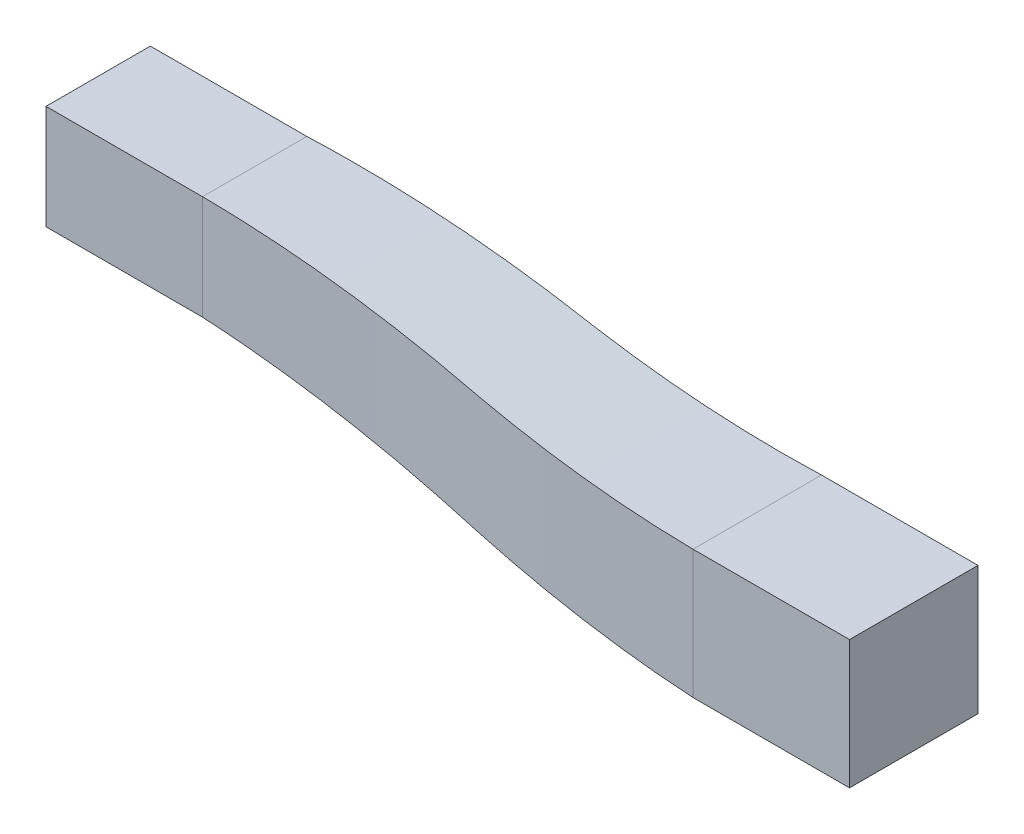
ISO-10303-21;
HEADER;
FILE_DESCRIPTION(('STEP AP214'),'2;1');
FILE_NAME('part.step','',(''),(''),'','','');
FILE_SCHEMA(('AUTOMOTIVE_DESIGN { 1 0 10303 214 1 1 1 1 }'));
ENDSEC;
DATA;
#1=APPLICATION_CONTEXT('core data for automotive mechanical design processes');
#2=APPLICATION_PROTOCOL_DEFINITION('international standard','automotive_design',2000,#1);
#3=PRODUCT_CONTEXT('',#1,'mechanical');
#4=PRODUCT('Part','Part','',(#3));
#5=PRODUCT_RELATED_PRODUCT_CATEGORY('part','',(#4));
#6=PRODUCT_DEFINITION_FORMATION('','',#4);
#7=PRODUCT_DEFINITION_CONTEXT('part definition',#1,'design');
#8=PRODUCT_DEFINITION('design','',#6,#7);
#9=PRODUCT_DEFINITION_SHAPE('','',#8);
#10=(LENGTH_UNIT() NAMED_UNIT(*) SI_UNIT(.MILLI.,.METRE.));
#11=(NAMED_UNIT(*) PLANE_ANGLE_UNIT() SI_UNIT($,.RADIAN.));
#12=(NAMED_UNIT(*) SI_UNIT($,.STERADIAN.) SOLID_ANGLE_UNIT());
#13=UNCERTAINTY_MEASURE_WITH_UNIT(LENGTH_MEASURE(1.E-05),#10,'distance_accuracy_value','');
#14=(GEOMETRIC_REPRESENTATION_CONTEXT(3) GLOBAL_UNCERTAINTY_ASSIGNED_CONTEXT((#13)) GLOBAL_UNIT_ASSIGNED_CONTEXT((#10,
#11,#12)) REPRESENTATION_CONTEXT('',''));
#15=CARTESIAN_POINT('',(0.,0.,0.));
#16=DIRECTION('',(0.,0.,1.));
#17=DIRECTION('',(1.,0.,0.));
#18=AXIS2_PLACEMENT_3D('',#15,#16,#17);
#19=CARTESIAN_POINT('',(1021.37315576226,9.46789488822745,125.73));
#20=CARTESIAN_POINT('',(869.226053043045,7.57979946099006,122.103179117669));
#21=CARTESIAN_POINT('',(717.318679962298,22.2117274041479,118.476358235337));
#22=CARTESIAN_POINT('',(393.85544304639,89.2840384754609,110.602358235337));
#23=CARTESIAN_POINT('',(215.92105118721,106.129276935199,106.355179117669));
#24=CARTESIAN_POINT('',(37.7577690383184,103.335476998145,102.108));
#25=CARTESIAN_POINT('',(1021.37315576226,9.46789488822746,115.2525));
#26=CARTESIAN_POINT('',(869.226053043045,7.57979946099006,111.927914191196));
#27=CARTESIAN_POINT('',(717.318679962298,22.2117274041479,108.603328382393));
#28=CARTESIAN_POINT('',(393.85544304639,89.2840384754609,101.385495049059));
#29=CARTESIAN_POINT('',(215.92105118721,106.129276935199,97.4922475245296));
#30=CARTESIAN_POINT('',(37.7577690383184,103.335476998145,93.599));
#31=CARTESIAN_POINT('',(1021.37315576226,9.46789488822747,94.2975));
#32=CARTESIAN_POINT('',(869.226053043045,7.5797994609901,91.5773843382515));
#33=CARTESIAN_POINT('',(717.318679962298,22.211727404148,88.8572686765031));
#34=CARTESIAN_POINT('',(393.85544304639,89.284038475461,82.9517686765031));
#35=CARTESIAN_POINT('',(215.921051187211,106.129276935199,79.7663843382515));
#36=CARTESIAN_POINT('',(37.7577690383184,103.335476998145,76.581));
#37=CARTESIAN_POINT('',(1021.37315576226,9.46789488822745,62.865));
#38=CARTESIAN_POINT('',(869.226053043045,7.57979946099004,61.0515895588344));
#39=CARTESIAN_POINT('',(717.318679962298,22.2117274041479,59.2381791176687));
#40=CARTESIAN_POINT('',(393.85544304639,89.2840384754609,55.3011791176687));
#41=CARTESIAN_POINT('',(215.92105118721,106.129276935199,53.1775895588343));
#42=CARTESIAN_POINT('',(37.7577690383184,103.335476998145,51.054));
#43=CARTESIAN_POINT('',(1021.37315576226,9.46789488822748,31.4325));
#44=CARTESIAN_POINT('',(869.226053043045,7.5797994609901,30.5257947794172));
#45=CARTESIAN_POINT('',(717.318679962298,22.211727404148,29.6190895588343));
#46=CARTESIAN_POINT('',(393.85544304639,89.284038475461,27.6505895588344));
#47=CARTESIAN_POINT('',(215.92105118721,106.129276935199,26.5887947794172));
#48=CARTESIAN_POINT('',(37.7577690383184,103.335476998145,25.527));
#49=CARTESIAN_POINT('',(1021.37315576226,9.46789488822747,10.4775));
#50=CARTESIAN_POINT('',(869.226053043045,7.57979946099008,10.1752649264724));
#51=CARTESIAN_POINT('',(717.318679962298,22.2117274041479,9.87302985294478));
#52=CARTESIAN_POINT('',(393.85544304639,89.2840384754609,9.21686318627812));
#53=CARTESIAN_POINT('',(215.92105118721,106.129276935199,8.86293159313906));
#54=CARTESIAN_POINT('',(37.7577690383184,103.335476998145,8.509));
#55=CARTESIAN_POINT('',(1021.37315576226,9.46789488822748,-10.4775));
#56=CARTESIAN_POINT('',(869.226053043045,7.57979946099008,-10.1752649264724));
#57=CARTESIAN_POINT('',(717.318679962298,22.2117274041479,-9.87302985294478));
#58=CARTESIAN_POINT('',(393.85544304639,89.2840384754609,-9.21686318627812));
#59=CARTESIAN_POINT('',(215.92105118721,106.129276935199,-8.86293159313906));
#60=CARTESIAN_POINT('',(37.7577690383184,103.335476998145,-8.509));
#61=CARTESIAN_POINT('',(1021.37315576226,9.4678948882275,-31.4325));
#62=CARTESIAN_POINT('',(869.226053043045,7.57979946099013,-30.5257947794172));
#63=CARTESIAN_POINT('',(717.318679962298,22.211727404148,-29.6190895588344));
#64=CARTESIAN_POINT('',(393.85544304639,89.2840384754611,-27.6505895588344));
#65=CARTESIAN_POINT('',(215.921051187211,106.1292769352,-26.5887947794172));
#66=CARTESIAN_POINT('',(37.7577690383184,103.335476998145,-25.5270000000001));
#67=CARTESIAN_POINT('',(1021.37315576226,9.46789488822747,-62.865));
#68=CARTESIAN_POINT('',(869.226053043045,7.57979946099003,-61.0515895588343));
#69=CARTESIAN_POINT('',(717.318679962298,22.2117274041478,-59.2381791176687));
#70=CARTESIAN_POINT('',(393.85544304639,89.2840384754607,-55.3011791176686));
#71=CARTESIAN_POINT('',(215.92105118721,106.129276935199,-53.1775895588343));
#72=CARTESIAN_POINT('',(37.7577690383184,103.335476998145,-51.0539999999999));
#73=CARTESIAN_POINT('',(1021.37315576226,9.46789488822751,-94.2975000000001));
#74=CARTESIAN_POINT('',(869.226053043045,7.57979946099013,-91.5773843382516));
#75=CARTESIAN_POINT('',(717.318679962298,22.211727404148,-88.8572686765031));
#76=CARTESIAN_POINT('',(393.85544304639,89.2840384754611,-82.9517686765031));
#77=CARTESIAN_POINT('',(215.921051187211,106.129276935199,-79.7663843382516));
#78=CARTESIAN_POINT('',(37.7577690383184,103.335476998145,-76.5810000000001));
#79=CARTESIAN_POINT('',(1021.37315576226,9.4678948882275,-115.2525));
#80=CARTESIAN_POINT('',(869.226053043045,7.57979946099008,-111.927914191196));
#81=CARTESIAN_POINT('',(717.318679962298,22.2117274041479,-108.603328382393));
#82=CARTESIAN_POINT('',(393.85544304639,89.2840384754609,-101.385495049059));
#83=CARTESIAN_POINT('',(215.92105118721,106.129276935199,-97.4922475245296));
#84=CARTESIAN_POINT('',(37.7577690383184,103.335476998145,-93.599));
#85=CARTESIAN_POINT('',(1021.37315576226,9.46789488822752,-125.73));
#86=CARTESIAN_POINT('',(869.226053043045,7.57979946099011,-122.103179117669));
#87=CARTESIAN_POINT('',(717.318679962298,22.211727404148,-118.476358235337));
#88=CARTESIAN_POINT('',(393.85544304639,89.2840384754609,-110.602358235337));
#89=CARTESIAN_POINT('',(215.92105118721,106.129276935199,-106.355179117669));
#90=CARTESIAN_POINT('',(37.7577690383184,103.335476998145,-102.108));
#91=B_SPLINE_SURFACE_WITH_KNOTS('',3,3,((#19,#20,#21,#22,#23,#24),(#25,#26,#27,#28,#29,#30),
(#31,#32,#33,#34,#35,#36),(#37,#38,#39,#40,#41,#42),(#43,#44,#45,#46,#47,#48),(#49,#50,#51,#52,
#53,#54),(#55,#56,#57,#58,#59,#60),(#61,#62,#63,#64,#65,#66),(#67,#68,#69,#70,#71,#72),(#73,#74,
#75,#76,#77,#78),(#79,#80,#81,#82,#83,#84),(#85,#86,#87,#88,#89,#90)),.UNSPECIFIED.,.F.,.F.,.F.,
(4,1,1,1,2,1,1,1,4),(4,2,4),(0.75,0.78125,0.8125,0.84375,0.875,0.90625,0.9375,0.96875,1.),(0.,
0.460607173270421,1.),.UNSPECIFIED.);
#92=DIRECTION('',(0.,0.,1.));
#93=VECTOR('',#92,1.);
#94=CARTESIAN_POINT('',(1021.37315576226,9.46789488822745,125.73));
#95=LINE('',#94,#93);
#96=CARTESIAN_POINT('',(1021.37315576226,9.46789488822752,-125.73));
#97=VERTEX_POINT('',#96);
#98=CARTESIAN_POINT('',(1021.37315576226,9.46789488822745,125.73));
#99=VERTEX_POINT('',#98);
#100=EDGE_CURVE('E173',#97,#99,#95,.T.);
#101=CARTESIAN_POINT('',(1021.37315576226,9.46789488822752,-125.73));
#102=CARTESIAN_POINT('',(869.226053043045,7.57979946099011,-122.103179117669));
#103=CARTESIAN_POINT('',(717.318679962298,22.211727404148,-118.476358235337));
#104=CARTESIAN_POINT('',(393.85544304639,89.2840384754609,-110.602358235337));
#105=CARTESIAN_POINT('',(215.92105118721,106.129276935199,-106.355179117669));
#106=CARTESIAN_POINT('',(37.7577690383184,103.335476998145,-102.108));
#107=B_SPLINE_CURVE_WITH_KNOTS('',3,(#101,#102,#103,#104,#105,#106),.UNSPECIFIED.,.F.,.F.,(4,2,
4),(0.,0.460607173270421,1.),.UNSPECIFIED.);
#108=CARTESIAN_POINT('',(37.7577690383184,103.335476998145,-102.108));
#109=VERTEX_POINT('',#108);
#110=EDGE_CURVE('E183',#97,#109,#107,.T.);
#111=DIRECTION('',(0.,0.,-1.));
#112=VECTOR('',#111,1.);
#113=CARTESIAN_POINT('',(37.7577690383184,103.335476998145,-102.108));
#114=LINE('',#113,#112);
#115=CARTESIAN_POINT('',(37.7577690383184,103.335476998145,102.108));
#116=VERTEX_POINT('',#115);
#117=EDGE_CURVE('E181',#116,#109,#114,.T.);
#118=CARTESIAN_POINT('',(1021.37315576226,9.46789488822745,125.73));
#119=CARTESIAN_POINT('',(869.226053043045,7.57979946099006,122.103179117669));
#120=CARTESIAN_POINT('',(717.318679962298,22.2117274041479,118.476358235337));
#121=CARTESIAN_POINT('',(393.85544304639,89.2840384754609,110.602358235337));
#122=CARTESIAN_POINT('',(215.92105118721,106.129276935199,106.355179117669));
#123=CARTESIAN_POINT('',(37.7577690383184,103.335476998145,102.108));
#124=B_SPLINE_CURVE_WITH_KNOTS('',3,(#118,#119,#120,#121,#122,#123),.UNSPECIFIED.,.F.,.F.,(4,2,
4),(0.,0.460607173270421,1.),.UNSPECIFIED.);
#125=EDGE_CURVE('E162',#99,#116,#124,.T.);
#126=ORIENTED_EDGE('',*,*,#100,.F.);
#127=ORIENTED_EDGE('',*,*,#110,.T.);
#128=ORIENTED_EDGE('',*,*,#117,.F.);
#129=ORIENTED_EDGE('',*,*,#125,.F.);
#130=EDGE_LOOP('',(#126,#127,#128,#129));
#131=FACE_BOUND('',#130,.T.);
#132=ADVANCED_FACE('F115',(#131),#91,.T.);
#133=CARTESIAN_POINT('',(1021.37315576226,-241.992105111773,125.73));
#134=CARTESIAN_POINT('',(869.226053043045,-236.626558774347,122.103179117669));
#135=CARTESIAN_POINT('',(717.318679962298,-214.740989066527,118.476358235337));
#136=CARTESIAN_POINT('',(393.85544304639,-131.920677995214,110.602358235337));
#137=CARTESIAN_POINT('',(215.92105118721,-106.581081300138,106.355179117669));
#138=CARTESIAN_POINT('',(37.7577690383184,-100.880523001855,102.108));
#139=CARTESIAN_POINT('',(1021.37315576226,-221.037105111773,125.73));
#140=CARTESIAN_POINT('',(869.226053043045,-216.276028921403,122.103179117669));
#141=CARTESIAN_POINT('',(717.318679962298,-194.994929360637,118.476358235337));
#142=CARTESIAN_POINT('',(393.85544304639,-113.486951622658,110.602358235337));
#143=CARTESIAN_POINT('',(215.92105118721,-88.85521811386,106.355179117669));
#144=CARTESIAN_POINT('',(37.7577690383184,-83.8625230018548,102.108));
#145=CARTESIAN_POINT('',(1021.37315576226,-179.127105111773,125.73));
#146=CARTESIAN_POINT('',(869.226053043045,-175.574969215513,122.103179117669));
#147=CARTESIAN_POINT('',(717.318679962298,-155.502809948858,118.476358235338));
#148=CARTESIAN_POINT('',(393.85544304639,-76.6194988775453,110.602358235338));
#149=CARTESIAN_POINT('',(215.921051187211,-53.4034917413038,106.355179117669));
#150=CARTESIAN_POINT('',(37.7577690383184,-49.8265230018548,102.108));
#151=CARTESIAN_POINT('',(1021.37315576226,-116.262105111772,125.73));
#152=CARTESIAN_POINT('',(869.226053043045,-114.523379656678,122.103179117668));
#153=CARTESIAN_POINT('',(717.318679962298,-96.2646308311893,118.476358235337));
#154=CARTESIAN_POINT('',(393.85544304639,-21.3183197598764,110.602358235337));
#155=CARTESIAN_POINT('',(215.92105118721,-0.225902182469349,106.355179117669));
#156=CARTESIAN_POINT('',(37.7577690383184,1.22747699814513,102.108));
#157=CARTESIAN_POINT('',(1021.37315576226,-53.3971051117727,125.73));
#158=CARTESIAN_POINT('',(869.226053043045,-53.4717900978445,122.103179117669));
#159=CARTESIAN_POINT('',(717.318679962298,-37.0264517135209,118.476358235338));
#160=CARTESIAN_POINT('',(393.85544304639,33.9828593577921,110.602358235338));
#161=CARTESIAN_POINT('',(215.92105118721,52.951687376365,106.355179117669));
#162=CARTESIAN_POINT('',(37.7577690383184,52.2814769981452,102.108));
#163=CARTESIAN_POINT('',(1021.37315576226,-11.4871051117725,125.73));
#164=CARTESIAN_POINT('',(869.226053043045,-12.7707303919547,122.103179117669));
#165=CARTESIAN_POINT('',(717.318679962298,2.46566769825833,118.476358235337));
#166=CARTESIAN_POINT('',(393.85544304639,70.8503121029046,110.602358235337));
#167=CARTESIAN_POINT('',(215.92105118721,88.4034137489212,106.355179117669));
#168=CARTESIAN_POINT('',(37.7577690383184,86.3174769981451,102.108));
#169=CARTESIAN_POINT('',(1021.37315576226,9.46789488822745,125.73));
#170=CARTESIAN_POINT('',(869.226053043045,7.57979946099006,122.103179117669));
#171=CARTESIAN_POINT('',(717.318679962298,22.2117274041479,118.476358235337));
#172=CARTESIAN_POINT('',(393.85544304639,89.2840384754609,110.602358235337));
#173=CARTESIAN_POINT('',(215.92105118721,106.129276935199,106.355179117669));
#174=CARTESIAN_POINT('',(37.7577690383184,103.335476998145,102.108));
#175=B_SPLINE_SURFACE_WITH_KNOTS('',3,3,((#133,#134,#135,#136,#137,#138),(#139,#140,#141,#142,
#143,#144),(#145,#146,#147,#148,#149,#150),(#151,#152,#153,#154,#155,#156),(#157,#158,#159,#160,
#161,#162),(#163,#164,#165,#166,#167,#168),(#169,#170,#171,#172,#173,#174)),.UNSPECIFIED.,.F.,
.F.,.F.,(4,1,1,1,4),(4,2,4),(0.5,0.5625,0.625,0.6875,0.75),(0.,0.460607173270421,1.),.UNSPECIFIED.);
#176=DIRECTION('',(0.,-1.,0.));
#177=VECTOR('',#176,1.);
#178=CARTESIAN_POINT('',(1021.37315576226,9.46789488822745,125.73));
#179=LINE('',#178,#177);
#180=CARTESIAN_POINT('',(1021.37315576226,-241.992105111773,125.73));
#181=VERTEX_POINT('',#180);
#182=EDGE_CURVE('E157',#99,#181,#179,.T.);
#183=DIRECTION('',(0.,1.,0.));
#184=VECTOR('',#183,1.);
#185=CARTESIAN_POINT('',(37.7577690383184,-100.880523001855,102.108));
#186=LINE('',#185,#184);
#187=CARTESIAN_POINT('',(37.7577690383184,-100.880523001855,102.108));
#188=VERTEX_POINT('',#187);
#189=EDGE_CURVE('E297',#188,#116,#186,.T.);
#190=CARTESIAN_POINT('',(1021.37315576226,-241.992105111773,125.73));
#191=CARTESIAN_POINT('',(869.226053043045,-236.626558774347,122.103179117669));
#192=CARTESIAN_POINT('',(717.318679962298,-214.740989066527,118.476358235337));
#193=CARTESIAN_POINT('',(393.85544304639,-131.920677995214,110.602358235337));
#194=CARTESIAN_POINT('',(215.92105118721,-106.581081300138,106.355179117669));
#195=CARTESIAN_POINT('',(37.7577690383184,-100.880523001855,102.108));
#196=B_SPLINE_CURVE_WITH_KNOTS('',3,(#190,#191,#192,#193,#194,#195),.UNSPECIFIED.,.F.,.F.,(4,2,
4),(0.,0.460607173270421,1.),.UNSPECIFIED.);
#197=EDGE_CURVE('E165',#181,#188,#196,.T.);
#198=ORIENTED_EDGE('',*,*,#182,.F.);
#199=ORIENTED_EDGE('',*,*,#125,.T.);
#200=ORIENTED_EDGE('',*,*,#189,.F.);
#201=ORIENTED_EDGE('',*,*,#197,.F.);
#202=EDGE_LOOP('',(#198,#199,#200,#201));
#203=FACE_BOUND('',#202,.T.);
#204=ADVANCED_FACE('F160',(#203),#175,.T.);
#205=CARTESIAN_POINT('',(1021.37315576226,-241.992105111773,-125.73));
#206=CARTESIAN_POINT('',(869.226053043045,-236.626558774347,-122.103179117669));
#207=CARTESIAN_POINT('',(717.318679962298,-214.740989066527,-118.476358235337));
#208=CARTESIAN_POINT('',(393.85544304639,-131.920677995214,-110.602358235337));
#209=CARTESIAN_POINT('',(215.92105118721,-106.581081300138,-106.355179117669));
#210=CARTESIAN_POINT('',(37.7577690383184,-100.880523001855,-102.108));
#211=CARTESIAN_POINT('',(1021.37315576226,-241.992105111773,-104.775));
#212=CARTESIAN_POINT('',(869.226053043045,-236.626558774347,-101.752649264724));
#213=CARTESIAN_POINT('',(717.318679962298,-214.740989066527,-98.7302985294479));
#214=CARTESIAN_POINT('',(393.85544304639,-131.920677995214,-92.1686318627812));
#215=CARTESIAN_POINT('',(215.92105118721,-106.581081300138,-88.6293159313906));
#216=CARTESIAN_POINT('',(37.7577690383184,-100.880523001855,-85.09));
#217=CARTESIAN_POINT('',(1021.37315576226,-241.992105111773,-62.8650000000001));
#218=CARTESIAN_POINT('',(869.226053043045,-236.626558774348,-61.0515895588344));
#219=CARTESIAN_POINT('',(717.318679962298,-214.740989066527,-59.2381791176688));
#220=CARTESIAN_POINT('',(393.85544304639,-131.920677995214,-55.3011791176688));
#221=CARTESIAN_POINT('',(215.921051187211,-106.581081300138,-53.1775895588344));
#222=CARTESIAN_POINT('',(37.7577690383184,-100.880523001855,-51.054));
#223=CARTESIAN_POINT('',(1021.37315576226,-241.992105111772,0.));
#224=CARTESIAN_POINT('',(869.226053043045,-236.626558774347,0.));
#225=CARTESIAN_POINT('',(717.318679962298,-214.740989066527,0.));
#226=CARTESIAN_POINT('',(393.85544304639,-131.920677995214,0.));
#227=CARTESIAN_POINT('',(215.92105118721,-106.581081300138,0.));
#228=CARTESIAN_POINT('',(37.7577690383184,-100.880523001855,0.));
#229=CARTESIAN_POINT('',(1021.37315576226,-241.992105111773,62.865));
#230=CARTESIAN_POINT('',(869.226053043045,-236.626558774348,61.0515895588343));
#231=CARTESIAN_POINT('',(717.318679962298,-214.740989066527,59.2381791176687));
#232=CARTESIAN_POINT('',(393.85544304639,-131.920677995214,55.3011791176687));
#233=CARTESIAN_POINT('',(215.92105118721,-106.581081300138,53.1775895588343));
#234=CARTESIAN_POINT('',(37.7577690383184,-100.880523001855,51.054));
#235=CARTESIAN_POINT('',(1021.37315576226,-241.992105111773,104.775));
#236=CARTESIAN_POINT('',(869.226053043045,-236.626558774347,101.752649264724));
#237=CARTESIAN_POINT('',(717.318679962298,-214.740989066527,98.7302985294478));
#238=CARTESIAN_POINT('',(393.85544304639,-131.920677995214,92.1686318627812));
#239=CARTESIAN_POINT('',(215.92105118721,-106.581081300138,88.6293159313906));
#240=CARTESIAN_POINT('',(37.7577690383184,-100.880523001855,85.09));
#241=CARTESIAN_POINT('',(1021.37315576226,-241.992105111773,125.73));
#242=CARTESIAN_POINT('',(869.226053043045,-236.626558774347,122.103179117669));
#243=CARTESIAN_POINT('',(717.318679962298,-214.740989066527,118.476358235337));
#244=CARTESIAN_POINT('',(393.85544304639,-131.920677995214,110.602358235337));
#245=CARTESIAN_POINT('',(215.92105118721,-106.581081300138,106.355179117669));
#246=CARTESIAN_POINT('',(37.7577690383184,-100.880523001855,102.108));
#247=B_SPLINE_SURFACE_WITH_KNOTS('',3,3,((#205,#206,#207,#208,#209,#210),(#211,#212,#213,#214,
#215,#216),(#217,#218,#219,#220,#221,#222),(#223,#224,#225,#226,#227,#228),(#229,#230,#231,#232,
#233,#234),(#235,#236,#237,#238,#239,#240),(#241,#242,#243,#244,#245,#246)),.UNSPECIFIED.,.F.,
.F.,.F.,(4,1,1,1,4),(4,2,4),(0.25,0.3125,0.375,0.4375,0.5),(0.,0.460607173270421,1.),.UNSPECIFIED.);
#248=DIRECTION('',(0.,0.,-1.));
#249=VECTOR('',#248,1.);
#250=CARTESIAN_POINT('',(1021.37315576226,-241.992105111773,125.73));
#251=LINE('',#250,#249);
#252=CARTESIAN_POINT('',(1021.37315576226,-241.992105111773,-125.73));
#253=VERTEX_POINT('',#252);
#254=EDGE_CURVE('E172',#181,#253,#251,.T.);
#255=DIRECTION('',(0.,0.,1.));
#256=VECTOR('',#255,1.);
#257=CARTESIAN_POINT('',(37.7577690383184,-100.880523001855,-102.108));
#258=LINE('',#257,#256);
#259=CARTESIAN_POINT('',(37.7577690383184,-100.880523001855,-102.108));
#260=VERTEX_POINT('',#259);
#261=EDGE_CURVE('E13',#260,#188,#258,.T.);
#262=CARTESIAN_POINT('',(1021.37315576226,-241.992105111773,-125.73));
#263=CARTESIAN_POINT('',(869.226053043045,-236.626558774347,-122.103179117669));
#264=CARTESIAN_POINT('',(717.318679962298,-214.740989066527,-118.476358235337));
#265=CARTESIAN_POINT('',(393.85544304639,-131.920677995214,-110.602358235337));
#266=CARTESIAN_POINT('',(215.92105118721,-106.581081300138,-106.355179117669));
#267=CARTESIAN_POINT('',(37.7577690383184,-100.880523001855,-102.108));
#268=B_SPLINE_CURVE_WITH_KNOTS('',3,(#262,#263,#264,#265,#266,#267),.UNSPECIFIED.,.F.,.F.,(4,2,
4),(0.,0.460607173270421,1.),.UNSPECIFIED.);
#269=EDGE_CURVE('E135',#253,#260,#268,.T.);
#270=ORIENTED_EDGE('',*,*,#254,.F.);
#271=ORIENTED_EDGE('',*,*,#197,.T.);
#272=ORIENTED_EDGE('',*,*,#261,.F.);
#273=ORIENTED_EDGE('',*,*,#269,.F.);
#274=EDGE_LOOP('',(#270,#271,#272,#273));
#275=FACE_BOUND('',#274,.T.);
#276=ADVANCED_FACE('F337',(#275),#247,.T.);
#277=CARTESIAN_POINT('',(1021.37315576226,9.46789488822752,-125.73));
#278=CARTESIAN_POINT('',(869.226053043045,7.57979946099011,-122.103179117669));
#279=CARTESIAN_POINT('',(717.318679962298,22.211727404148,-118.476358235337));
#280=CARTESIAN_POINT('',(393.85544304639,89.2840384754609,-110.602358235337));
#281=CARTESIAN_POINT('',(215.92105118721,106.129276935199,-106.355179117669));
#282=CARTESIAN_POINT('',(37.7577690383184,103.335476998145,-102.108));
#283=CARTESIAN_POINT('',(1021.37315576226,-11.4871051117725,-125.73));
#284=CARTESIAN_POINT('',(869.226053043045,-12.7707303919547,-122.103179117669));
#285=CARTESIAN_POINT('',(717.318679962298,2.46566769825838,-118.476358235337));
#286=CARTESIAN_POINT('',(393.85544304639,70.8503121029047,-110.602358235337));
#287=CARTESIAN_POINT('',(215.92105118721,88.4034137489212,-106.355179117669));
#288=CARTESIAN_POINT('',(37.7577690383184,86.3174769981452,-102.108));
#289=CARTESIAN_POINT('',(1021.37315576226,-53.3971051117727,-125.73));
#290=CARTESIAN_POINT('',(869.226053043045,-53.4717900978444,-122.103179117669));
#291=CARTESIAN_POINT('',(717.318679962298,-37.0264517135209,-118.476358235338));
#292=CARTESIAN_POINT('',(393.85544304639,33.9828593577921,-110.602358235338));
#293=CARTESIAN_POINT('',(215.921051187211,52.9516873763649,-106.355179117669));
#294=CARTESIAN_POINT('',(37.7577690383184,52.2814769981451,-102.108));
#295=CARTESIAN_POINT('',(1021.37315576226,-116.262105111772,-125.73));
#296=CARTESIAN_POINT('',(869.226053043045,-114.523379656678,-122.103179117669));
#297=CARTESIAN_POINT('',(717.318679962298,-96.2646308311893,-118.476358235337));
#298=CARTESIAN_POINT('',(393.85544304639,-21.3183197598764,-110.602358235337));
#299=CARTESIAN_POINT('',(215.92105118721,-0.225902182469283,-106.355179117669));
#300=CARTESIAN_POINT('',(37.7577690383184,1.22747699814521,-102.108));
#301=CARTESIAN_POINT('',(1021.37315576226,-179.127105111773,-125.73));
#302=CARTESIAN_POINT('',(869.226053043045,-175.574969215513,-122.103179117669));
#303=CARTESIAN_POINT('',(717.318679962298,-155.502809948858,-118.476358235338));
#304=CARTESIAN_POINT('',(393.85544304639,-76.6194988775453,-110.602358235338));
#305=CARTESIAN_POINT('',(215.92105118721,-53.4034917413038,-106.355179117669));
#306=CARTESIAN_POINT('',(37.7577690383184,-49.8265230018549,-102.108));
#307=CARTESIAN_POINT('',(1021.37315576226,-221.037105111772,-125.73));
#308=CARTESIAN_POINT('',(869.226053043045,-216.276028921403,-122.103179117669));
#309=CARTESIAN_POINT('',(717.318679962298,-194.994929360637,-118.476358235337));
#310=CARTESIAN_POINT('',(393.85544304639,-113.486951622658,-110.602358235337));
#311=CARTESIAN_POINT('',(215.92105118721,-88.85521811386,-106.355179117669));
#312=CARTESIAN_POINT('',(37.7577690383184,-83.8625230018548,-102.108));
#313=CARTESIAN_POINT('',(1021.37315576226,-241.992105111773,-125.73));
#314=CARTESIAN_POINT('',(869.226053043045,-236.626558774347,-122.103179117669));
#315=CARTESIAN_POINT('',(717.318679962298,-214.740989066527,-118.476358235337));
#316=CARTESIAN_POINT('',(393.85544304639,-131.920677995214,-110.602358235337));
#317=CARTESIAN_POINT('',(215.92105118721,-106.581081300138,-106.355179117669));
#318=CARTESIAN_POINT('',(37.7577690383184,-100.880523001855,-102.108));
#319=B_SPLINE_SURFACE_WITH_KNOTS('',3,3,((#277,#278,#279,#280,#281,#282),(#283,#284,#285,#286,
#287,#288),(#289,#290,#291,#292,#293,#294),(#295,#296,#297,#298,#299,#300),(#301,#302,#303,#304,
#305,#306),(#307,#308,#309,#310,#311,#312),(#313,#314,#315,#316,#317,#318)),.UNSPECIFIED.,.F.,
.F.,.F.,(4,1,1,1,4),(4,2,4),(0.,0.0625,0.125,0.1875,0.25),(0.,0.460607173270421,1.),.UNSPECIFIED.);
#320=DIRECTION('',(0.,1.,0.));
#321=VECTOR('',#320,1.);
#322=CARTESIAN_POINT('',(1021.37315576226,-241.992105111773,-125.73));
#323=LINE('',#322,#321);
#324=EDGE_CURVE('E121',#253,#97,#323,.T.);
#325=DIRECTION('',(0.,-1.,0.));
#326=VECTOR('',#325,1.);
#327=CARTESIAN_POINT('',(37.7577690383184,103.335476998145,-102.108));
#328=LINE('',#327,#326);
#329=EDGE_CURVE('E127',#109,#260,#328,.T.);
#330=ORIENTED_EDGE('',*,*,#324,.F.);
#331=ORIENTED_EDGE('',*,*,#269,.T.);
#332=ORIENTED_EDGE('',*,*,#329,.F.);
#333=ORIENTED_EDGE('',*,*,#110,.F.);
#334=EDGE_LOOP('',(#330,#331,#332,#333));
#335=FACE_BOUND('',#334,.T.);
#336=ADVANCED_FACE('F341',(#335),#319,.T.);
#337=CARTESIAN_POINT('',(-268.566230961682,-100.880523001855,102.108));
#338=DIRECTION('',(0.,0.,-1.));
#339=DIRECTION('',(-1.,0.,0.));
#340=AXIS2_PLACEMENT_3D('',#337,#338,#339);
#341=PLANE('',#340);
#342=ORIENTED_EDGE('',*,*,#189,.T.);
#343=DIRECTION('',(1.,0.,0.));
#344=VECTOR('',#343,1.);
#345=CARTESIAN_POINT('',(-268.566230961682,103.335476998145,102.108));
#346=LINE('',#345,#344);
#347=CARTESIAN_POINT('',(-268.566230961682,103.335476998145,102.108));
#348=VERTEX_POINT('',#347);
#349=EDGE_CURVE('E491',#348,#116,#346,.T.);
#350=ORIENTED_EDGE('',*,*,#349,.F.);
#351=DIRECTION('',(0.,1.,0.));
#352=VECTOR('',#351,1.);
#353=CARTESIAN_POINT('',(-268.566230961682,-100.880523001855,102.108));
#354=LINE('',#353,#352);
#355=CARTESIAN_POINT('',(-268.566230961682,-100.880523001855,102.108));
#356=VERTEX_POINT('',#355);
#357=EDGE_CURVE('E205',#356,#348,#354,.T.);
#358=ORIENTED_EDGE('',*,*,#357,.F.);
#359=DIRECTION('',(1.,0.,0.));
#360=VECTOR('',#359,1.);
#361=CARTESIAN_POINT('',(-268.566230961682,-100.880523001855,102.108));
#362=LINE('',#361,#360);
#363=EDGE_CURVE('E273',#356,#188,#362,.T.);
#364=ORIENTED_EDGE('',*,*,#363,.T.);
#365=EDGE_LOOP('',(#342,#350,#358,#364));
#366=FACE_BOUND('',#365,.T.);
#367=ADVANCED_FACE('F388',(#366),#341,.F.);
#368=CARTESIAN_POINT('',(-268.566230961682,103.335476998145,-102.108));
#369=DIRECTION('',(0.,-1.,0.));
#370=DIRECTION('',(0.,0.,-1.));
#371=AXIS2_PLACEMENT_3D('',#368,#369,#370);
#372=PLANE('',#371);
#373=ORIENTED_EDGE('',*,*,#117,.T.);
#374=DIRECTION('',(1.,0.,0.));
#375=VECTOR('',#374,1.);
#376=CARTESIAN_POINT('',(-268.566230961682,103.335476998145,-102.108));
#377=LINE('',#376,#375);
#378=CARTESIAN_POINT('',(-268.566230961682,103.335476998145,-102.108));
#379=VERTEX_POINT('',#378);
#380=EDGE_CURVE('E272',#379,#109,#377,.T.);
#381=ORIENTED_EDGE('',*,*,#380,.F.);
#382=DIRECTION('',(0.,0.,-1.));
#383=VECTOR('',#382,1.);
#384=CARTESIAN_POINT('',(-268.566230961682,103.335476998145,-102.108));
#385=LINE('',#384,#383);
#386=EDGE_CURVE('E431',#348,#379,#385,.T.);
#387=ORIENTED_EDGE('',*,*,#386,.F.);
#388=ORIENTED_EDGE('',*,*,#349,.T.);
#389=EDGE_LOOP('',(#373,#381,#387,#388));
#390=FACE_BOUND('',#389,.T.);
#391=ADVANCED_FACE('F489',(#390),#372,.F.);
#392=CARTESIAN_POINT('',(-268.566230961682,103.335476998145,-102.108));
#393=DIRECTION('',(0.,0.,1.));
#394=DIRECTION('',(0.,-1.,0.));
#395=AXIS2_PLACEMENT_3D('',#392,#393,#394);
#396=PLANE('',#395);
#397=ORIENTED_EDGE('',*,*,#329,.T.);
#398=DIRECTION('',(1.,0.,0.));
#399=VECTOR('',#398,1.);
#400=CARTESIAN_POINT('',(-268.566230961682,-100.880523001855,-102.108));
#401=LINE('',#400,#399);
#402=CARTESIAN_POINT('',(-268.566230961682,-100.880523001855,-102.108));
#403=VERTEX_POINT('',#402);
#404=EDGE_CURVE('E269',#403,#260,#401,.T.);
#405=ORIENTED_EDGE('',*,*,#404,.F.);
#406=DIRECTION('',(0.,-1.,0.));
#407=VECTOR('',#406,1.);
#408=CARTESIAN_POINT('',(-268.566230961682,103.335476998145,-102.108));
#409=LINE('',#408,#407);
#410=EDGE_CURVE('E427',#379,#403,#409,.T.);
#411=ORIENTED_EDGE('',*,*,#410,.F.);
#412=ORIENTED_EDGE('',*,*,#380,.T.);
#413=EDGE_LOOP('',(#397,#405,#411,#412));
#414=FACE_BOUND('',#413,.T.);
#415=ADVANCED_FACE('F254',(#414),#396,.F.);
#416=CARTESIAN_POINT('',(-268.566230961682,-100.880523001855,-102.108));
#417=DIRECTION('',(0.,1.,0.));
#418=DIRECTION('',(0.,0.,1.));
#419=AXIS2_PLACEMENT_3D('',#416,#417,#418);
#420=PLANE('',#419);
#421=ORIENTED_EDGE('',*,*,#261,.T.);
#422=ORIENTED_EDGE('',*,*,#363,.F.);
#423=DIRECTION('',(0.,0.,1.));
#424=VECTOR('',#423,1.);
#425=CARTESIAN_POINT('',(-268.566230961682,-100.880523001855,-102.108));
#426=LINE('',#425,#424);
#427=EDGE_CURVE('E425',#403,#356,#426,.T.);
#428=ORIENTED_EDGE('',*,*,#427,.F.);
#429=ORIENTED_EDGE('',*,*,#404,.T.);
#430=EDGE_LOOP('',(#421,#422,#428,#429));
#431=FACE_BOUND('',#430,.T.);
#432=ADVANCED_FACE('F249',(#431),#420,.F.);
#433=CARTESIAN_POINT('',(-268.566230961682,0.,0.));
#434=DIRECTION('',(1.,0.,0.));
#435=DIRECTION('',(0.,0.,-1.));
#436=AXIS2_PLACEMENT_3D('',#433,#434,#435);
#437=PLANE('',#436);
#438=ORIENTED_EDGE('',*,*,#357,.T.);
#439=ORIENTED_EDGE('',*,*,#386,.T.);
#440=ORIENTED_EDGE('',*,*,#410,.T.);
#441=ORIENTED_EDGE('',*,*,#427,.T.);
#442=EDGE_LOOP('',(#438,#439,#440,#441));
#443=FACE_BOUND('',#442,.T.);
#444=ADVANCED_FACE('F245',(#443),#437,.F.);
#445=CARTESIAN_POINT('',(1327.69715576226,-241.992105111773,-125.73));
#446=DIRECTION('',(0.,0.,1.));
#447=DIRECTION('',(0.,-1.,0.));
#448=AXIS2_PLACEMENT_3D('',#445,#446,#447);
#449=PLANE('',#448);
#450=ORIENTED_EDGE('',*,*,#324,.T.);
#451=DIRECTION('',(-1.,0.,0.));
#452=VECTOR('',#451,1.);
#453=CARTESIAN_POINT('',(1327.69715576226,9.4678948882275,-125.73));
#454=LINE('',#453,#452);
#455=CARTESIAN_POINT('',(1327.69715576226,9.4678948882275,-125.73));
#456=VERTEX_POINT('',#455);
#457=EDGE_CURVE('E195',#456,#97,#454,.T.);
#458=ORIENTED_EDGE('',*,*,#457,.F.);
#459=DIRECTION('',(0.,1.,0.));
#460=VECTOR('',#459,1.);
#461=CARTESIAN_POINT('',(1327.69715576226,-241.992105111773,-125.73));
#462=LINE('',#461,#460);
#463=CARTESIAN_POINT('',(1327.69715576226,-241.992105111773,-125.73));
#464=VERTEX_POINT('',#463);
#465=EDGE_CURVE('E478',#464,#456,#462,.T.);
#466=ORIENTED_EDGE('',*,*,#465,.F.);
#467=DIRECTION('',(-1.,0.,0.));
#468=VECTOR('',#467,1.);
#469=CARTESIAN_POINT('',(1327.69715576226,-241.992105111773,-125.73));
#470=LINE('',#469,#468);
#471=EDGE_CURVE('E207',#464,#253,#470,.T.);
#472=ORIENTED_EDGE('',*,*,#471,.T.);
#473=EDGE_LOOP('',(#450,#458,#466,#472));
#474=FACE_BOUND('',#473,.T.);
#475=ADVANCED_FACE('F236',(#474),#449,.F.);
#476=CARTESIAN_POINT('',(1327.69715576226,9.46789488822745,125.73));
#477=DIRECTION('',(0.,-1.,0.));
#478=DIRECTION('',(0.,0.,-1.));
#479=AXIS2_PLACEMENT_3D('',#476,#477,#478);
#480=PLANE('',#479);
#481=ORIENTED_EDGE('',*,*,#100,.T.);
#482=DIRECTION('',(-1.,0.,0.));
#483=VECTOR('',#482,1.);
#484=CARTESIAN_POINT('',(1327.69715576226,9.46789488822745,125.73));
#485=LINE('',#484,#483);
#486=CARTESIAN_POINT('',(1327.69715576226,9.46789488822745,125.73));
#487=VERTEX_POINT('',#486);
#488=EDGE_CURVE('E192',#487,#99,#485,.T.);
#489=ORIENTED_EDGE('',*,*,#488,.F.);
#490=DIRECTION('',(0.,0.,1.));
#491=VECTOR('',#490,1.);
#492=CARTESIAN_POINT('',(1327.69715576226,9.46789488822745,125.73));
#493=LINE('',#492,#491);
#494=EDGE_CURVE('E475',#456,#487,#493,.T.);
#495=ORIENTED_EDGE('',*,*,#494,.F.);
#496=ORIENTED_EDGE('',*,*,#457,.T.);
#497=EDGE_LOOP('',(#481,#489,#495,#496));
#498=FACE_BOUND('',#497,.T.);
#499=ADVANCED_FACE('F189',(#498),#480,.F.);
#500=CARTESIAN_POINT('',(1327.69715576226,9.46789488822745,125.73));
#501=DIRECTION('',(0.,0.,-1.));
#502=DIRECTION('',(0.,1.,0.));
#503=AXIS2_PLACEMENT_3D('',#500,#501,#502);
#504=PLANE('',#503);
#505=ORIENTED_EDGE('',*,*,#182,.T.);
#506=DIRECTION('',(-1.,0.,0.));
#507=VECTOR('',#506,1.);
#508=CARTESIAN_POINT('',(1327.69715576226,-241.992105111773,125.73));
#509=LINE('',#508,#507);
#510=CARTESIAN_POINT('',(1327.69715576226,-241.992105111773,125.73));
#511=VERTEX_POINT('',#510);
#512=EDGE_CURVE('E203',#511,#181,#509,.T.);
#513=ORIENTED_EDGE('',*,*,#512,.F.);
#514=DIRECTION('',(0.,-1.,0.));
#515=VECTOR('',#514,1.);
#516=CARTESIAN_POINT('',(1327.69715576226,9.46789488822745,125.73));
#517=LINE('',#516,#515);
#518=EDGE_CURVE('E202',#487,#511,#517,.T.);
#519=ORIENTED_EDGE('',*,*,#518,.F.);
#520=ORIENTED_EDGE('',*,*,#488,.T.);
#521=EDGE_LOOP('',(#505,#513,#519,#520));
#522=FACE_BOUND('',#521,.T.);
#523=ADVANCED_FACE('F200',(#522),#504,.F.);
#524=CARTESIAN_POINT('',(1327.69715576226,-241.992105111773,125.73));
#525=DIRECTION('',(0.,1.,0.));
#526=DIRECTION('',(0.,0.,1.));
#527=AXIS2_PLACEMENT_3D('',#524,#525,#526);
#528=PLANE('',#527);
#529=ORIENTED_EDGE('',*,*,#254,.T.);
#530=ORIENTED_EDGE('',*,*,#471,.F.);
#531=DIRECTION('',(0.,0.,-1.));
#532=VECTOR('',#531,1.);
#533=CARTESIAN_POINT('',(1327.69715576226,-241.992105111773,125.73));
#534=LINE('',#533,#532);
#535=EDGE_CURVE('E306',#511,#464,#534,.T.);
#536=ORIENTED_EDGE('',*,*,#535,.F.);
#537=ORIENTED_EDGE('',*,*,#512,.T.);
#538=EDGE_LOOP('',(#529,#530,#536,#537));
#539=FACE_BOUND('',#538,.T.);
#540=ADVANCED_FACE('F318',(#539),#528,.F.);
#541=CARTESIAN_POINT('',(1327.69715576226,0.,0.));
#542=DIRECTION('',(-1.,0.,0.));
#543=DIRECTION('',(0.,0.,1.));
#544=AXIS2_PLACEMENT_3D('',#541,#542,#543);
#545=PLANE('',#544);
#546=ORIENTED_EDGE('',*,*,#465,.T.);
#547=ORIENTED_EDGE('',*,*,#494,.T.);
#548=ORIENTED_EDGE('',*,*,#518,.T.);
#549=ORIENTED_EDGE('',*,*,#535,.T.);
#550=EDGE_LOOP('',(#546,#547,#548,#549));
#551=FACE_BOUND('',#550,.T.);
#552=ADVANCED_FACE('F327',(#551),#545,.F.);
#553=CLOSED_SHELL('',(#132,#204,#276,#336,#367,#391,#415,#432,#444,#475,#499,#523,#540,#552));
#554=MANIFOLD_SOLID_BREP('B2',#553);
#555=ADVANCED_BREP_SHAPE_REPRESENTATION('',(#18,#554),#14);
#556=SHAPE_DEFINITION_REPRESENTATION(#9,#555);
ENDSEC;
END-ISO-10303-21;
